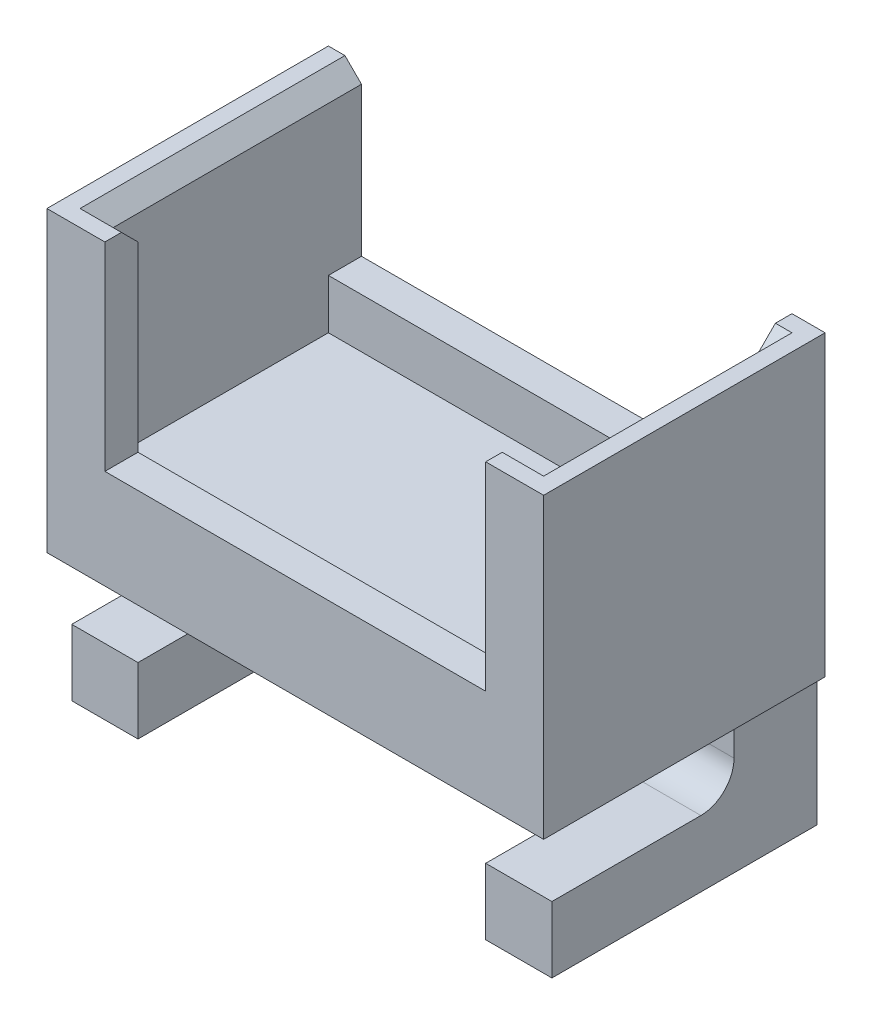
ISO-10303-21;
HEADER;
FILE_DESCRIPTION(('STEP AP214'),'2;1');
FILE_NAME('part.step','',(''),(''),'','','');
FILE_SCHEMA(('AUTOMOTIVE_DESIGN { 1 0 10303 214 1 1 1 1 }'));
ENDSEC;
DATA;
#1=APPLICATION_CONTEXT('core data for automotive mechanical design processes');
#2=APPLICATION_PROTOCOL_DEFINITION('international standard','automotive_design',2000,#1);
#3=PRODUCT_CONTEXT('',#1,'mechanical');
#4=PRODUCT('Part','Part','',(#3));
#5=PRODUCT_RELATED_PRODUCT_CATEGORY('part','',(#4));
#6=PRODUCT_DEFINITION_FORMATION('','',#4);
#7=PRODUCT_DEFINITION_CONTEXT('part definition',#1,'design');
#8=PRODUCT_DEFINITION('design','',#6,#7);
#9=PRODUCT_DEFINITION_SHAPE('','',#8);
#10=(LENGTH_UNIT() NAMED_UNIT(*) SI_UNIT(.MILLI.,.METRE.));
#11=(NAMED_UNIT(*) PLANE_ANGLE_UNIT() SI_UNIT($,.RADIAN.));
#12=(NAMED_UNIT(*) SI_UNIT($,.STERADIAN.) SOLID_ANGLE_UNIT());
#13=UNCERTAINTY_MEASURE_WITH_UNIT(LENGTH_MEASURE(1.E-05),#10,'distance_accuracy_value','');
#14=(GEOMETRIC_REPRESENTATION_CONTEXT(3) GLOBAL_UNCERTAINTY_ASSIGNED_CONTEXT((#13)) GLOBAL_UNIT_ASSIGNED_CONTEXT((#10,
#11,#12)) REPRESENTATION_CONTEXT('',''));
#15=CARTESIAN_POINT('',(0.,0.,0.));
#16=DIRECTION('',(0.,0.,1.));
#17=DIRECTION('',(1.,0.,0.));
#18=AXIS2_PLACEMENT_3D('',#15,#16,#17);
#19=CARTESIAN_POINT('',(-13.,15.,-6.5));
#20=DIRECTION('',(0.,0.,1.));
#21=DIRECTION('',(1.,0.,0.));
#22=AXIS2_PLACEMENT_3D('',#19,#20,#21);
#23=PLANE('',#22);
#24=DIRECTION('',(0.,-1.,0.));
#25=VECTOR('',#24,1.);
#26=CARTESIAN_POINT('',(13.,15.,-6.5));
#27=LINE('',#26,#25);
#28=CARTESIAN_POINT('',(13.,5.,-6.5));
#29=VERTEX_POINT('',#28);
#30=CARTESIAN_POINT('',(13.,2.,-6.5));
#31=VERTEX_POINT('',#30);
#32=EDGE_CURVE('E275',#29,#31,#27,.T.);
#33=ORIENTED_EDGE('',*,*,#32,.F.);
#34=DIRECTION('',(-1.,0.,0.));
#35=VECTOR('',#34,1.);
#36=CARTESIAN_POINT('',(-13.,5.,-6.5));
#37=LINE('',#36,#35);
#38=CARTESIAN_POINT('',(-13.,5.,-6.5));
#39=VERTEX_POINT('',#38);
#40=EDGE_CURVE('E256',#29,#39,#37,.T.);
#41=ORIENTED_EDGE('',*,*,#40,.T.);
#42=DIRECTION('',(0.,-1.,0.));
#43=VECTOR('',#42,1.);
#44=CARTESIAN_POINT('',(-13.,15.,-6.5));
#45=LINE('',#44,#43);
#46=CARTESIAN_POINT('',(-13.,2.,-6.5));
#47=VERTEX_POINT('',#46);
#48=EDGE_CURVE('E286',#39,#47,#45,.T.);
#49=ORIENTED_EDGE('',*,*,#48,.T.);
#50=DIRECTION('',(1.,0.,0.));
#51=VECTOR('',#50,1.);
#52=CARTESIAN_POINT('',(0.,2.,-6.5));
#53=LINE('',#52,#51);
#54=EDGE_CURVE('E283',#47,#31,#53,.T.);
#55=ORIENTED_EDGE('',*,*,#54,.T.);
#56=EDGE_LOOP('',(#33,#41,#49,#55));
#57=FACE_BOUND('',#56,.T.);
#58=ADVANCED_FACE('F48',(#57),#23,.T.);
#59=CARTESIAN_POINT('',(0.,15.,0.));
#60=DIRECTION('',(0.,-1.,0.));
#61=DIRECTION('',(0.,0.,-1.));
#62=AXIS2_PLACEMENT_3D('',#59,#60,#61);
#63=PLANE('',#62);
#64=DIRECTION('',(-1.,0.,0.));
#65=VECTOR('',#64,1.);
#66=CARTESIAN_POINT('',(-13.,15.,7.5));
#67=LINE('',#66,#65);
#68=CARTESIAN_POINT('',(-11.5,15.,7.5));
#69=VERTEX_POINT('',#68);
#70=CARTESIAN_POINT('',(-14.,15.,7.5));
#71=VERTEX_POINT('',#70);
#72=EDGE_CURVE('E339',#69,#71,#67,.T.);
#73=ORIENTED_EDGE('',*,*,#72,.T.);
#74=DIRECTION('',(0.,0.,-1.));
#75=VECTOR('',#74,1.);
#76=CARTESIAN_POINT('',(-14.,15.,-8.5));
#77=LINE('',#76,#75);
#78=CARTESIAN_POINT('',(-14.,15.,-8.5));
#79=VERTEX_POINT('',#78);
#80=EDGE_CURVE('E342',#71,#79,#77,.T.);
#81=ORIENTED_EDGE('',*,*,#80,.T.);
#82=DIRECTION('',(-1.,0.,0.));
#83=VECTOR('',#82,1.);
#84=CARTESIAN_POINT('',(15.,15.,-8.5));
#85=LINE('',#84,#83);
#86=CARTESIAN_POINT('',(-15.,15.,-8.5));
#87=VERTEX_POINT('',#86);
#88=EDGE_CURVE('E305',#79,#87,#85,.T.);
#89=ORIENTED_EDGE('',*,*,#88,.T.);
#90=DIRECTION('',(0.,0.,1.));
#91=VECTOR('',#90,1.);
#92=CARTESIAN_POINT('',(-15.,15.,-8.5));
#93=LINE('',#92,#91);
#94=CARTESIAN_POINT('',(-15.,15.,8.5));
#95=VERTEX_POINT('',#94);
#96=EDGE_CURVE('E285',#87,#95,#93,.T.);
#97=ORIENTED_EDGE('',*,*,#96,.T.);
#98=DIRECTION('',(1.,0.,0.));
#99=VECTOR('',#98,1.);
#100=CARTESIAN_POINT('',(15.,15.,8.5));
#101=LINE('',#100,#99);
#102=CARTESIAN_POINT('',(-11.5,15.,8.5));
#103=VERTEX_POINT('',#102);
#104=EDGE_CURVE('E297',#95,#103,#101,.T.);
#105=ORIENTED_EDGE('',*,*,#104,.T.);
#106=DIRECTION('',(0.,0.,1.));
#107=VECTOR('',#106,1.);
#108=CARTESIAN_POINT('',(-11.5,15.,-8.501));
#109=LINE('',#108,#107);
#110=EDGE_CURVE('E483',#69,#103,#109,.T.);
#111=ORIENTED_EDGE('',*,*,#110,.F.);
#112=EDGE_LOOP('',(#73,#81,#89,#97,#105,#111));
#113=FACE_BOUND('',#112,.T.);
#114=ADVANCED_FACE('F714',(#113),#63,.F.);
#115=CARTESIAN_POINT('',(15.,2.,-8.5));
#116=DIRECTION('',(0.,0.,1.));
#117=DIRECTION('',(1.,0.,0.));
#118=AXIS2_PLACEMENT_3D('',#115,#116,#117);
#119=PLANE('',#118);
#120=DIRECTION('',(0.,1.,0.));
#121=VECTOR('',#120,1.);
#122=CARTESIAN_POINT('',(-13.,15.,-8.5));
#123=LINE('',#122,#121);
#124=CARTESIAN_POINT('',(-13.,5.,-8.5));
#125=VERTEX_POINT('',#124);
#126=CARTESIAN_POINT('',(-13.,14.,-8.5));
#127=VERTEX_POINT('',#126);
#128=EDGE_CURVE('E379',#125,#127,#123,.T.);
#129=ORIENTED_EDGE('',*,*,#128,.F.);
#130=DIRECTION('',(-1.,0.,0.));
#131=VECTOR('',#130,1.);
#132=CARTESIAN_POINT('',(15.,5.,-8.5));
#133=LINE('',#132,#131);
#134=CARTESIAN_POINT('',(13.,5.,-8.5));
#135=VERTEX_POINT('',#134);
#136=EDGE_CURVE('E268',#135,#125,#133,.T.);
#137=ORIENTED_EDGE('',*,*,#136,.F.);
#138=DIRECTION('',(0.,1.,0.));
#139=VECTOR('',#138,1.);
#140=CARTESIAN_POINT('',(13.,2.,-8.5));
#141=LINE('',#140,#139);
#142=CARTESIAN_POINT('',(13.,15.,-8.5));
#143=VERTEX_POINT('',#142);
#144=EDGE_CURVE('E269',#135,#143,#141,.T.);
#145=ORIENTED_EDGE('',*,*,#144,.T.);
#146=CARTESIAN_POINT('',(15.,15.,-8.5));
#147=VERTEX_POINT('',#146);
#148=EDGE_CURVE('E306',#147,#143,#85,.T.);
#149=ORIENTED_EDGE('',*,*,#148,.F.);
#150=DIRECTION('',(0.,-1.,0.));
#151=VECTOR('',#150,1.);
#152=CARTESIAN_POINT('',(15.,2.,-8.5));
#153=LINE('',#152,#151);
#154=CARTESIAN_POINT('',(15.,-3.,-8.5));
#155=VERTEX_POINT('',#154);
#156=EDGE_CURVE('E323',#147,#155,#153,.T.);
#157=ORIENTED_EDGE('',*,*,#156,.T.);
#158=DIRECTION('',(1.,0.,0.));
#159=VECTOR('',#158,1.);
#160=CARTESIAN_POINT('',(-15.,-3.,-8.5));
#161=LINE('',#160,#159);
#162=CARTESIAN_POINT('',(14.5,-3.,-8.5));
#163=VERTEX_POINT('',#162);
#164=EDGE_CURVE('E430',#163,#155,#161,.T.);
#165=ORIENTED_EDGE('',*,*,#164,.F.);
#166=DIRECTION('',(0.,1.,0.));
#167=VECTOR('',#166,1.);
#168=CARTESIAN_POINT('',(14.5,-7.,-8.5));
#169=LINE('',#168,#167);
#170=CARTESIAN_POINT('',(14.5,-11.,-8.5));
#171=VERTEX_POINT('',#170);
#172=EDGE_CURVE('E564',#171,#163,#169,.T.);
#173=ORIENTED_EDGE('',*,*,#172,.F.);
#174=DIRECTION('',(1.,0.,0.));
#175=VECTOR('',#174,1.);
#176=CARTESIAN_POINT('',(14.5,-11.,-8.5));
#177=LINE('',#176,#175);
#178=CARTESIAN_POINT('',(10.5,-11.,-8.5));
#179=VERTEX_POINT('',#178);
#180=EDGE_CURVE('E514',#179,#171,#177,.T.);
#181=ORIENTED_EDGE('',*,*,#180,.F.);
#182=DIRECTION('',(0.,1.,0.));
#183=VECTOR('',#182,1.);
#184=CARTESIAN_POINT('',(10.5,-7.,-8.5));
#185=LINE('',#184,#183);
#186=CARTESIAN_POINT('',(10.5,-3.,-8.5));
#187=VERTEX_POINT('',#186);
#188=EDGE_CURVE('E567',#179,#187,#185,.T.);
#189=ORIENTED_EDGE('',*,*,#188,.T.);
#190=CARTESIAN_POINT('',(-10.5,-3.,-8.5));
#191=VERTEX_POINT('',#190);
#192=EDGE_CURVE('E639',#191,#187,#161,.T.);
#193=ORIENTED_EDGE('',*,*,#192,.F.);
#194=DIRECTION('',(0.,1.,0.));
#195=VECTOR('',#194,1.);
#196=CARTESIAN_POINT('',(-10.5,-7.,-8.5));
#197=LINE('',#196,#195);
#198=CARTESIAN_POINT('',(-10.5,-11.,-8.5));
#199=VERTEX_POINT('',#198);
#200=EDGE_CURVE('E618',#199,#191,#197,.T.);
#201=ORIENTED_EDGE('',*,*,#200,.F.);
#202=DIRECTION('',(-1.,0.,0.));
#203=VECTOR('',#202,1.);
#204=CARTESIAN_POINT('',(-14.5,-11.,-8.5));
#205=LINE('',#204,#203);
#206=CARTESIAN_POINT('',(-14.5,-11.,-8.5));
#207=VERTEX_POINT('',#206);
#208=EDGE_CURVE('E571',#199,#207,#205,.T.);
#209=ORIENTED_EDGE('',*,*,#208,.T.);
#210=DIRECTION('',(0.,1.,0.));
#211=VECTOR('',#210,1.);
#212=CARTESIAN_POINT('',(-14.5,-7.,-8.5));
#213=LINE('',#212,#211);
#214=CARTESIAN_POINT('',(-14.5,-3.,-8.5));
#215=VERTEX_POINT('',#214);
#216=EDGE_CURVE('E622',#207,#215,#213,.T.);
#217=ORIENTED_EDGE('',*,*,#216,.T.);
#218=CARTESIAN_POINT('',(-15.,-3.,-8.5));
#219=VERTEX_POINT('',#218);
#220=EDGE_CURVE('E636',#219,#215,#161,.T.);
#221=ORIENTED_EDGE('',*,*,#220,.F.);
#222=DIRECTION('',(0.,-1.,0.));
#223=VECTOR('',#222,1.);
#224=CARTESIAN_POINT('',(-15.,2.,-8.5));
#225=LINE('',#224,#223);
#226=EDGE_CURVE('E333',#87,#219,#225,.T.);
#227=ORIENTED_EDGE('',*,*,#226,.F.);
#228=ORIENTED_EDGE('',*,*,#88,.F.);
#229=DIRECTION('',(0.70710678118655,-0.707106781186545,0.));
#230=VECTOR('',#229,1.);
#231=CARTESIAN_POINT('',(-13.,14.,-8.5));
#232=LINE('',#231,#230);
#233=EDGE_CURVE('E345',#79,#127,#232,.T.);
#234=ORIENTED_EDGE('',*,*,#233,.T.);
#235=EDGE_LOOP('',(#129,#137,#145,#149,#157,#165,#173,#181,#189,#193,#201,#209,#217,#221,#227,
#228,#234));
#236=FACE_BOUND('',#235,.T.);
#237=ADVANCED_FACE('F429',(#236),#119,.F.);
#238=CARTESIAN_POINT('',(-15.,2.,-8.5));
#239=DIRECTION('',(1.,0.,0.));
#240=DIRECTION('',(0.,0.,-1.));
#241=AXIS2_PLACEMENT_3D('',#238,#239,#240);
#242=PLANE('',#241);
#243=ORIENTED_EDGE('',*,*,#226,.T.);
#244=DIRECTION('',(0.,0.,-1.));
#245=VECTOR('',#244,1.);
#246=CARTESIAN_POINT('',(-15.,-3.,8.5));
#247=LINE('',#246,#245);
#248=CARTESIAN_POINT('',(-15.,-3.,8.5));
#249=VERTEX_POINT('',#248);
#250=EDGE_CURVE('E632',#249,#219,#247,.T.);
#251=ORIENTED_EDGE('',*,*,#250,.F.);
#252=DIRECTION('',(0.,-1.,0.));
#253=VECTOR('',#252,1.);
#254=CARTESIAN_POINT('',(-15.,2.,8.5));
#255=LINE('',#254,#253);
#256=EDGE_CURVE('E330',#95,#249,#255,.T.);
#257=ORIENTED_EDGE('',*,*,#256,.F.);
#258=ORIENTED_EDGE('',*,*,#96,.F.);
#259=EDGE_LOOP('',(#243,#251,#257,#258));
#260=FACE_BOUND('',#259,.T.);
#261=ADVANCED_FACE('F646',(#260),#242,.F.);
#262=CARTESIAN_POINT('',(15.,2.,8.5));
#263=DIRECTION('',(0.,0.,1.));
#264=DIRECTION('',(1.,0.,0.));
#265=AXIS2_PLACEMENT_3D('',#262,#263,#264);
#266=PLANE('',#265);
#267=DIRECTION('',(0.,1.,0.));
#268=VECTOR('',#267,1.);
#269=CARTESIAN_POINT('',(11.5,15.,8.5));
#270=LINE('',#269,#268);
#271=CARTESIAN_POINT('',(11.5,3.,8.5));
#272=VERTEX_POINT('',#271);
#273=CARTESIAN_POINT('',(11.5,15.,8.5));
#274=VERTEX_POINT('',#273);
#275=EDGE_CURVE('E479',#272,#274,#270,.T.);
#276=ORIENTED_EDGE('',*,*,#275,.F.);
#277=DIRECTION('',(1.,0.,0.));
#278=VECTOR('',#277,1.);
#279=CARTESIAN_POINT('',(-11.5,3.,8.5));
#280=LINE('',#279,#278);
#281=CARTESIAN_POINT('',(-11.5,3.,8.5));
#282=VERTEX_POINT('',#281);
#283=EDGE_CURVE('E475',#282,#272,#280,.T.);
#284=ORIENTED_EDGE('',*,*,#283,.F.);
#285=DIRECTION('',(0.,-1.,0.));
#286=VECTOR('',#285,1.);
#287=CARTESIAN_POINT('',(-11.5,15.,8.5));
#288=LINE('',#287,#286);
#289=EDGE_CURVE('E466',#103,#282,#288,.T.);
#290=ORIENTED_EDGE('',*,*,#289,.F.);
#291=ORIENTED_EDGE('',*,*,#104,.F.);
#292=ORIENTED_EDGE('',*,*,#256,.T.);
#293=DIRECTION('',(-1.,0.,0.));
#294=VECTOR('',#293,1.);
#295=CARTESIAN_POINT('',(15.,-3.,8.5));
#296=LINE('',#295,#294);
#297=CARTESIAN_POINT('',(15.,-3.,8.5));
#298=VERTEX_POINT('',#297);
#299=EDGE_CURVE('E384',#298,#249,#296,.T.);
#300=ORIENTED_EDGE('',*,*,#299,.F.);
#301=DIRECTION('',(0.,-1.,0.));
#302=VECTOR('',#301,1.);
#303=CARTESIAN_POINT('',(15.,2.,8.5));
#304=LINE('',#303,#302);
#305=CARTESIAN_POINT('',(15.,15.,8.5));
#306=VERTEX_POINT('',#305);
#307=EDGE_CURVE('E327',#306,#298,#304,.T.);
#308=ORIENTED_EDGE('',*,*,#307,.F.);
#309=EDGE_CURVE('E291',#274,#306,#101,.T.);
#310=ORIENTED_EDGE('',*,*,#309,.F.);
#311=EDGE_LOOP('',(#276,#284,#290,#291,#292,#300,#308,#310));
#312=FACE_BOUND('',#311,.T.);
#313=ADVANCED_FACE('F420',(#312),#266,.T.);
#314=CARTESIAN_POINT('',(15.,2.,-8.5));
#315=DIRECTION('',(1.,0.,0.));
#316=DIRECTION('',(0.,0.,-1.));
#317=AXIS2_PLACEMENT_3D('',#314,#315,#316);
#318=PLANE('',#317);
#319=ORIENTED_EDGE('',*,*,#307,.T.);
#320=DIRECTION('',(0.,0.,1.));
#321=VECTOR('',#320,1.);
#322=CARTESIAN_POINT('',(15.,-3.,-8.5));
#323=LINE('',#322,#321);
#324=EDGE_CURVE('E426',#155,#298,#323,.T.);
#325=ORIENTED_EDGE('',*,*,#324,.F.);
#326=ORIENTED_EDGE('',*,*,#156,.F.);
#327=DIRECTION('',(0.,0.,-1.));
#328=VECTOR('',#327,1.);
#329=CARTESIAN_POINT('',(15.,15.,-8.5));
#330=LINE('',#329,#328);
#331=EDGE_CURVE('E301',#306,#147,#330,.T.);
#332=ORIENTED_EDGE('',*,*,#331,.F.);
#333=EDGE_LOOP('',(#319,#325,#326,#332));
#334=FACE_BOUND('',#333,.T.);
#335=ADVANCED_FACE('F425',(#334),#318,.T.);
#336=ORIENTED_EDGE('',*,*,#148,.T.);
#337=DIRECTION('',(0.,0.,-1.));
#338=VECTOR('',#337,1.);
#339=CARTESIAN_POINT('',(13.,15.,-6.5));
#340=LINE('',#339,#338);
#341=CARTESIAN_POINT('',(13.,15.,-7.5));
#342=VERTEX_POINT('',#341);
#343=EDGE_CURVE('E279',#342,#143,#340,.T.);
#344=ORIENTED_EDGE('',*,*,#343,.F.);
#345=DIRECTION('',(1.,0.,0.));
#346=VECTOR('',#345,1.);
#347=CARTESIAN_POINT('',(13.,15.,-7.5));
#348=LINE('',#347,#346);
#349=CARTESIAN_POINT('',(14.,15.,-7.5));
#350=VERTEX_POINT('',#349);
#351=EDGE_CURVE('E361',#342,#350,#348,.T.);
#352=ORIENTED_EDGE('',*,*,#351,.T.);
#353=DIRECTION('',(0.,0.,1.));
#354=VECTOR('',#353,1.);
#355=CARTESIAN_POINT('',(14.,15.,6.5));
#356=LINE('',#355,#354);
#357=CARTESIAN_POINT('',(14.,15.,7.5));
#358=VERTEX_POINT('',#357);
#359=EDGE_CURVE('E358',#350,#358,#356,.T.);
#360=ORIENTED_EDGE('',*,*,#359,.T.);
#361=DIRECTION('',(-1.,0.,0.));
#362=VECTOR('',#361,1.);
#363=CARTESIAN_POINT('',(11.5,15.,7.5));
#364=LINE('',#363,#362);
#365=CARTESIAN_POINT('',(11.5,15.,7.5));
#366=VERTEX_POINT('',#365);
#367=EDGE_CURVE('E364',#358,#366,#364,.T.);
#368=ORIENTED_EDGE('',*,*,#367,.T.);
#369=DIRECTION('',(0.,0.,1.));
#370=VECTOR('',#369,1.);
#371=CARTESIAN_POINT('',(11.5,15.,-8.501));
#372=LINE('',#371,#370);
#373=EDGE_CURVE('E415',#366,#274,#372,.T.);
#374=ORIENTED_EDGE('',*,*,#373,.T.);
#375=ORIENTED_EDGE('',*,*,#309,.T.);
#376=ORIENTED_EDGE('',*,*,#331,.T.);
#377=EDGE_LOOP('',(#336,#344,#352,#360,#368,#374,#375,#376));
#378=FACE_BOUND('',#377,.T.);
#379=ADVANCED_FACE('F411',(#378),#63,.F.);
#380=CARTESIAN_POINT('',(13.,15.,-6.5));
#381=DIRECTION('',(-1.,0.,0.));
#382=DIRECTION('',(0.,0.,1.));
#383=AXIS2_PLACEMENT_3D('',#380,#381,#382);
#384=PLANE('',#383);
#385=DIRECTION('',(0.,-1.,0.));
#386=VECTOR('',#385,1.);
#387=CARTESIAN_POINT('',(13.,15.,6.5));
#388=LINE('',#387,#386);
#389=CARTESIAN_POINT('',(13.,14.,6.5));
#390=VERTEX_POINT('',#389);
#391=CARTESIAN_POINT('',(13.,2.,6.5));
#392=VERTEX_POINT('',#391);
#393=EDGE_CURVE('E495',#390,#392,#388,.T.);
#394=ORIENTED_EDGE('',*,*,#393,.F.);
#395=DIRECTION('',(0.,0.,-1.));
#396=VECTOR('',#395,1.);
#397=CARTESIAN_POINT('',(13.,14.,-6.5));
#398=LINE('',#397,#396);
#399=CARTESIAN_POINT('',(13.,14.,-6.5));
#400=VERTEX_POINT('',#399);
#401=EDGE_CURVE('E370',#390,#400,#398,.T.);
#402=ORIENTED_EDGE('',*,*,#401,.T.);
#403=DIRECTION('',(0.,0.707106781186545,-0.70710678118655));
#404=VECTOR('',#403,1.);
#405=CARTESIAN_POINT('',(13.,14.,-6.5));
#406=LINE('',#405,#404);
#407=EDGE_CURVE('E439',#400,#342,#406,.T.);
#408=ORIENTED_EDGE('',*,*,#407,.T.);
#409=ORIENTED_EDGE('',*,*,#343,.T.);
#410=ORIENTED_EDGE('',*,*,#144,.F.);
#411=DIRECTION('',(0.,0.,-1.));
#412=VECTOR('',#411,1.);
#413=CARTESIAN_POINT('',(13.,5.,-6.5));
#414=LINE('',#413,#412);
#415=EDGE_CURVE('E260',#29,#135,#414,.T.);
#416=ORIENTED_EDGE('',*,*,#415,.F.);
#417=ORIENTED_EDGE('',*,*,#32,.T.);
#418=DIRECTION('',(0.,0.,1.));
#419=VECTOR('',#418,1.);
#420=CARTESIAN_POINT('',(13.,2.,0.));
#421=LINE('',#420,#419);
#422=EDGE_CURVE('E320',#31,#392,#421,.T.);
#423=ORIENTED_EDGE('',*,*,#422,.T.);
#424=EDGE_LOOP('',(#394,#402,#408,#409,#410,#416,#417,#423));
#425=FACE_BOUND('',#424,.T.);
#426=ADVANCED_FACE('F273',(#425),#384,.T.);
#427=CARTESIAN_POINT('',(-13.,15.,-6.5));
#428=DIRECTION('',(1.,0.,0.));
#429=DIRECTION('',(0.,0.,-1.));
#430=AXIS2_PLACEMENT_3D('',#427,#428,#429);
#431=PLANE('',#430);
#432=ORIENTED_EDGE('',*,*,#48,.F.);
#433=DIRECTION('',(0.,0.,1.));
#434=VECTOR('',#433,1.);
#435=CARTESIAN_POINT('',(-13.,5.,-9.51749325564199));
#436=LINE('',#435,#434);
#437=EDGE_CURVE('E263',#125,#39,#436,.T.);
#438=ORIENTED_EDGE('',*,*,#437,.F.);
#439=ORIENTED_EDGE('',*,*,#128,.T.);
#440=DIRECTION('',(0.,0.,1.));
#441=VECTOR('',#440,1.);
#442=CARTESIAN_POINT('',(-13.,14.,6.5));
#443=LINE('',#442,#441);
#444=CARTESIAN_POINT('',(-13.,14.,6.5));
#445=VERTEX_POINT('',#444);
#446=EDGE_CURVE('E336',#127,#445,#443,.T.);
#447=ORIENTED_EDGE('',*,*,#446,.T.);
#448=DIRECTION('',(0.,-1.,0.));
#449=VECTOR('',#448,1.);
#450=CARTESIAN_POINT('',(-13.,15.,6.5));
#451=LINE('',#450,#449);
#452=CARTESIAN_POINT('',(-13.,2.,6.5));
#453=VERTEX_POINT('',#452);
#454=EDGE_CURVE('E293',#445,#453,#451,.T.);
#455=ORIENTED_EDGE('',*,*,#454,.T.);
#456=DIRECTION('',(0.,0.,-1.));
#457=VECTOR('',#456,1.);
#458=CARTESIAN_POINT('',(-13.,2.,0.));
#459=LINE('',#458,#457);
#460=EDGE_CURVE('E314',#453,#47,#459,.T.);
#461=ORIENTED_EDGE('',*,*,#460,.T.);
#462=EDGE_LOOP('',(#432,#438,#439,#447,#455,#461));
#463=FACE_BOUND('',#462,.T.);
#464=ADVANCED_FACE('F500',(#463),#431,.T.);
#465=CARTESIAN_POINT('',(-13.,15.,6.5));
#466=DIRECTION('',(0.,0.,-1.));
#467=DIRECTION('',(-1.,0.,0.));
#468=AXIS2_PLACEMENT_3D('',#465,#466,#467);
#469=PLANE('',#468);
#470=ORIENTED_EDGE('',*,*,#454,.F.);
#471=DIRECTION('',(1.,0.,0.));
#472=VECTOR('',#471,1.);
#473=CARTESIAN_POINT('',(-11.5,14.,6.5));
#474=LINE('',#473,#472);
#475=CARTESIAN_POINT('',(-11.5,14.,6.5));
#476=VERTEX_POINT('',#475);
#477=EDGE_CURVE('E352',#445,#476,#474,.T.);
#478=ORIENTED_EDGE('',*,*,#477,.T.);
#479=DIRECTION('',(0.,-1.,0.));
#480=VECTOR('',#479,1.);
#481=CARTESIAN_POINT('',(-11.5,15.,6.5));
#482=LINE('',#481,#480);
#483=CARTESIAN_POINT('',(-11.5,3.,6.5));
#484=VERTEX_POINT('',#483);
#485=EDGE_CURVE('E462',#476,#484,#482,.T.);
#486=ORIENTED_EDGE('',*,*,#485,.T.);
#487=DIRECTION('',(1.,0.,0.));
#488=VECTOR('',#487,1.);
#489=CARTESIAN_POINT('',(-11.5,3.,6.5));
#490=LINE('',#489,#488);
#491=CARTESIAN_POINT('',(11.5,3.,6.5));
#492=VERTEX_POINT('',#491);
#493=EDGE_CURVE('E460',#484,#492,#490,.T.);
#494=ORIENTED_EDGE('',*,*,#493,.T.);
#495=DIRECTION('',(0.,1.,0.));
#496=VECTOR('',#495,1.);
#497=CARTESIAN_POINT('',(11.5,15.,6.5));
#498=LINE('',#497,#496);
#499=CARTESIAN_POINT('',(11.5,14.,6.5));
#500=VERTEX_POINT('',#499);
#501=EDGE_CURVE('E453',#492,#500,#498,.T.);
#502=ORIENTED_EDGE('',*,*,#501,.T.);
#503=DIRECTION('',(1.,0.,0.));
#504=VECTOR('',#503,1.);
#505=CARTESIAN_POINT('',(13.,14.,6.5));
#506=LINE('',#505,#504);
#507=EDGE_CURVE('E348',#500,#390,#506,.T.);
#508=ORIENTED_EDGE('',*,*,#507,.T.);
#509=ORIENTED_EDGE('',*,*,#393,.T.);
#510=DIRECTION('',(-1.,0.,0.));
#511=VECTOR('',#510,1.);
#512=CARTESIAN_POINT('',(0.,2.,6.5));
#513=LINE('',#512,#511);
#514=EDGE_CURVE('E310',#392,#453,#513,.T.);
#515=ORIENTED_EDGE('',*,*,#514,.T.);
#516=EDGE_LOOP('',(#470,#478,#486,#494,#502,#508,#509,#515));
#517=FACE_BOUND('',#516,.T.);
#518=ADVANCED_FACE('F458',(#517),#469,.T.);
#519=CARTESIAN_POINT('',(0.,2.,0.));
#520=DIRECTION('',(0.,1.,0.));
#521=DIRECTION('',(0.,0.,1.));
#522=AXIS2_PLACEMENT_3D('',#519,#520,#521);
#523=PLANE('',#522);
#524=ORIENTED_EDGE('',*,*,#422,.F.);
#525=ORIENTED_EDGE('',*,*,#54,.F.);
#526=ORIENTED_EDGE('',*,*,#460,.F.);
#527=ORIENTED_EDGE('',*,*,#514,.F.);
#528=EDGE_LOOP('',(#524,#525,#526,#527));
#529=FACE_BOUND('',#528,.T.);
#530=ADVANCED_FACE('F504',(#529),#523,.T.);
#531=CARTESIAN_POINT('',(-11.5,3.,-8.501));
#532=DIRECTION('',(0.,-1.,0.));
#533=DIRECTION('',(0.,0.,-1.));
#534=AXIS2_PLACEMENT_3D('',#531,#532,#533);
#535=PLANE('',#534);
#536=DIRECTION('',(0.,0.,1.));
#537=VECTOR('',#536,1.);
#538=CARTESIAN_POINT('',(-11.5,3.,-8.501));
#539=LINE('',#538,#537);
#540=EDGE_CURVE('E482',#484,#282,#539,.T.);
#541=ORIENTED_EDGE('',*,*,#540,.T.);
#542=ORIENTED_EDGE('',*,*,#283,.T.);
#543=DIRECTION('',(0.,0.,1.));
#544=VECTOR('',#543,1.);
#545=CARTESIAN_POINT('',(11.5,3.,-8.501));
#546=LINE('',#545,#544);
#547=EDGE_CURVE('E488',#492,#272,#546,.T.);
#548=ORIENTED_EDGE('',*,*,#547,.F.);
#549=ORIENTED_EDGE('',*,*,#493,.F.);
#550=EDGE_LOOP('',(#541,#542,#548,#549));
#551=FACE_BOUND('',#550,.T.);
#552=ADVANCED_FACE('F731',(#551),#535,.F.);
#553=CARTESIAN_POINT('',(11.5,15.,-8.501));
#554=DIRECTION('',(1.,0.,0.));
#555=DIRECTION('',(0.,1.,0.));
#556=AXIS2_PLACEMENT_3D('',#553,#554,#555);
#557=PLANE('',#556);
#558=ORIENTED_EDGE('',*,*,#373,.F.);
#559=DIRECTION('',(0.,-0.707106781186545,-0.70710678118655));
#560=VECTOR('',#559,1.);
#561=CARTESIAN_POINT('',(11.5,14.,6.5));
#562=LINE('',#561,#560);
#563=EDGE_CURVE('E367',#366,#500,#562,.T.);
#564=ORIENTED_EDGE('',*,*,#563,.T.);
#565=ORIENTED_EDGE('',*,*,#501,.F.);
#566=ORIENTED_EDGE('',*,*,#547,.T.);
#567=ORIENTED_EDGE('',*,*,#275,.T.);
#568=EDGE_LOOP('',(#558,#564,#565,#566,#567));
#569=FACE_BOUND('',#568,.T.);
#570=ADVANCED_FACE('F452',(#569),#557,.F.);
#571=CARTESIAN_POINT('',(-11.5,15.,-8.501));
#572=DIRECTION('',(-1.,0.,0.));
#573=DIRECTION('',(0.,-1.,0.));
#574=AXIS2_PLACEMENT_3D('',#571,#572,#573);
#575=PLANE('',#574);
#576=ORIENTED_EDGE('',*,*,#485,.F.);
#577=DIRECTION('',(0.,0.707106781186545,0.70710678118655));
#578=VECTOR('',#577,1.);
#579=CARTESIAN_POINT('',(-11.5,14.,6.5));
#580=LINE('',#579,#578);
#581=EDGE_CURVE('E355',#476,#69,#580,.T.);
#582=ORIENTED_EDGE('',*,*,#581,.T.);
#583=ORIENTED_EDGE('',*,*,#110,.T.);
#584=ORIENTED_EDGE('',*,*,#289,.T.);
#585=ORIENTED_EDGE('',*,*,#540,.F.);
#586=EDGE_LOOP('',(#576,#582,#583,#584,#585));
#587=FACE_BOUND('',#586,.T.);
#588=ADVANCED_FACE('F753',(#587),#575,.F.);
#589=CARTESIAN_POINT('',(-13.,14.,6.5));
#590=DIRECTION('',(0.,0.70710678118655,-0.707106781186545));
#591=DIRECTION('',(-1.,0.,0.));
#592=AXIS2_PLACEMENT_3D('',#589,#590,#591);
#593=PLANE('',#592);
#594=ORIENTED_EDGE('',*,*,#581,.F.);
#595=ORIENTED_EDGE('',*,*,#477,.F.);
#596=DIRECTION('',(-0.577350269189627,0.577350269189623,0.577350269189627));
#597=VECTOR('',#596,1.);
#598=CARTESIAN_POINT('',(-8.66666666666665,9.66666666666668,2.16666666666665));
#599=LINE('',#598,#597);
#600=EDGE_CURVE('E375',#71,#445,#599,.F.);
#601=ORIENTED_EDGE('',*,*,#600,.F.);
#602=ORIENTED_EDGE('',*,*,#72,.F.);
#603=EDGE_LOOP('',(#594,#595,#601,#602));
#604=FACE_BOUND('',#603,.T.);
#605=ADVANCED_FACE('F747',(#604),#593,.T.);
#606=CARTESIAN_POINT('',(-13.,14.,-6.5));
#607=DIRECTION('',(0.707106781186545,0.70710678118655,0.));
#608=DIRECTION('',(0.,0.,-1.));
#609=AXIS2_PLACEMENT_3D('',#606,#607,#608);
#610=PLANE('',#609);
#611=ORIENTED_EDGE('',*,*,#233,.F.);
#612=ORIENTED_EDGE('',*,*,#80,.F.);
#613=ORIENTED_EDGE('',*,*,#600,.T.);
#614=ORIENTED_EDGE('',*,*,#446,.F.);
#615=EDGE_LOOP('',(#611,#612,#613,#614));
#616=FACE_BOUND('',#615,.T.);
#617=ADVANCED_FACE('F740',(#616),#610,.T.);
#618=CARTESIAN_POINT('',(-13.,14.,-6.5));
#619=DIRECTION('',(0.,0.70710678118655,0.707106781186545));
#620=DIRECTION('',(1.,0.,0.));
#621=AXIS2_PLACEMENT_3D('',#618,#619,#620);
#622=PLANE('',#621);
#623=ORIENTED_EDGE('',*,*,#407,.F.);
#624=DIRECTION('',(-0.577350269189627,-0.577350269189623,0.577350269189627));
#625=VECTOR('',#624,1.);
#626=CARTESIAN_POINT('',(4.3333333333333,5.33333333333336,2.1666666666667));
#627=LINE('',#626,#625);
#628=EDGE_CURVE('E380',#350,#400,#627,.T.);
#629=ORIENTED_EDGE('',*,*,#628,.F.);
#630=ORIENTED_EDGE('',*,*,#351,.F.);
#631=EDGE_LOOP('',(#623,#629,#630));
#632=FACE_BOUND('',#631,.T.);
#633=ADVANCED_FACE('F438',(#632),#622,.T.);
#634=CARTESIAN_POINT('',(13.,14.,-6.5));
#635=DIRECTION('',(-0.707106781186545,0.70710678118655,0.));
#636=DIRECTION('',(0.,0.,1.));
#637=AXIS2_PLACEMENT_3D('',#634,#635,#636);
#638=PLANE('',#637);
#639=ORIENTED_EDGE('',*,*,#628,.T.);
#640=ORIENTED_EDGE('',*,*,#401,.F.);
#641=DIRECTION('',(0.577350269189627,0.577350269189623,0.577350269189627));
#642=VECTOR('',#641,1.);
#643=CARTESIAN_POINT('',(4.33333333333329,5.33333333333336,-2.1666666666667));
#644=LINE('',#643,#642);
#645=EDGE_CURVE('E381',#358,#390,#644,.F.);
#646=ORIENTED_EDGE('',*,*,#645,.F.);
#647=ORIENTED_EDGE('',*,*,#359,.F.);
#648=EDGE_LOOP('',(#639,#640,#646,#647));
#649=FACE_BOUND('',#648,.T.);
#650=ADVANCED_FACE('F444',(#649),#638,.T.);
#651=CARTESIAN_POINT('',(-13.,14.,6.5));
#652=DIRECTION('',(0.,0.70710678118655,-0.707106781186545));
#653=DIRECTION('',(-1.,0.,0.));
#654=AXIS2_PLACEMENT_3D('',#651,#652,#653);
#655=PLANE('',#654);
#656=ORIENTED_EDGE('',*,*,#563,.F.);
#657=ORIENTED_EDGE('',*,*,#367,.F.);
#658=ORIENTED_EDGE('',*,*,#645,.T.);
#659=ORIENTED_EDGE('',*,*,#507,.F.);
#660=EDGE_LOOP('',(#656,#657,#658,#659));
#661=FACE_BOUND('',#660,.T.);
#662=ADVANCED_FACE('F448',(#661),#655,.T.);
#663=CARTESIAN_POINT('',(0.,-3.,0.));
#664=DIRECTION('',(0.,-1.,0.));
#665=DIRECTION('',(0.,0.,-1.));
#666=AXIS2_PLACEMENT_3D('',#663,#664,#665);
#667=PLANE('',#666);
#668=DIRECTION('',(0.,0.,1.));
#669=VECTOR('',#668,1.);
#670=CARTESIAN_POINT('',(10.5,-3.,-8.5));
#671=LINE('',#670,#669);
#672=CARTESIAN_POINT('',(10.5,-3.,-3.5));
#673=VERTEX_POINT('',#672);
#674=EDGE_CURVE('E536',#187,#673,#671,.T.);
#675=ORIENTED_EDGE('',*,*,#674,.T.);
#676=DIRECTION('',(1.,0.,0.));
#677=VECTOR('',#676,1.);
#678=CARTESIAN_POINT('',(12.5,-3.,-3.5));
#679=LINE('',#678,#677);
#680=CARTESIAN_POINT('',(14.5,-3.,-3.5));
#681=VERTEX_POINT('',#680);
#682=EDGE_CURVE('E554',#673,#681,#679,.T.);
#683=ORIENTED_EDGE('',*,*,#682,.T.);
#684=DIRECTION('',(0.,0.,-1.));
#685=VECTOR('',#684,1.);
#686=CARTESIAN_POINT('',(14.5,-3.,-3.5));
#687=LINE('',#686,#685);
#688=EDGE_CURVE('E551',#681,#163,#687,.T.);
#689=ORIENTED_EDGE('',*,*,#688,.T.);
#690=ORIENTED_EDGE('',*,*,#164,.T.);
#691=ORIENTED_EDGE('',*,*,#324,.T.);
#692=ORIENTED_EDGE('',*,*,#299,.T.);
#693=ORIENTED_EDGE('',*,*,#250,.T.);
#694=ORIENTED_EDGE('',*,*,#220,.T.);
#695=DIRECTION('',(0.,0.,-1.));
#696=VECTOR('',#695,1.);
#697=CARTESIAN_POINT('',(-14.5,-3.,-3.5));
#698=LINE('',#697,#696);
#699=CARTESIAN_POINT('',(-14.5,-3.,-3.5));
#700=VERTEX_POINT('',#699);
#701=EDGE_CURVE('E614',#700,#215,#698,.T.);
#702=ORIENTED_EDGE('',*,*,#701,.F.);
#703=DIRECTION('',(-1.,0.,0.));
#704=VECTOR('',#703,1.);
#705=CARTESIAN_POINT('',(-12.5,-3.,-3.5));
#706=LINE('',#705,#704);
#707=CARTESIAN_POINT('',(-10.5,-3.,-3.5));
#708=VERTEX_POINT('',#707);
#709=EDGE_CURVE('E610',#708,#700,#706,.T.);
#710=ORIENTED_EDGE('',*,*,#709,.F.);
#711=DIRECTION('',(0.,0.,1.));
#712=VECTOR('',#711,1.);
#713=CARTESIAN_POINT('',(-10.5,-3.,-8.5));
#714=LINE('',#713,#712);
#715=EDGE_CURVE('E595',#191,#708,#714,.T.);
#716=ORIENTED_EDGE('',*,*,#715,.F.);
#717=ORIENTED_EDGE('',*,*,#192,.T.);
#718=EDGE_LOOP('',(#675,#683,#689,#690,#691,#692,#693,#694,#702,#710,#716,#717));
#719=FACE_BOUND('',#718,.T.);
#720=ADVANCED_FACE('F644',(#719),#667,.T.);
#721=CARTESIAN_POINT('',(-10.5,-7.,-8.5));
#722=DIRECTION('',(-1.,0.,0.));
#723=DIRECTION('',(0.,0.,1.));
#724=AXIS2_PLACEMENT_3D('',#721,#722,#723);
#725=PLANE('',#724);
#726=ORIENTED_EDGE('',*,*,#715,.T.);
#727=DIRECTION('',(0.,1.,0.));
#728=VECTOR('',#727,1.);
#729=CARTESIAN_POINT('',(-10.5,-7.,-3.5));
#730=LINE('',#729,#728);
#731=CARTESIAN_POINT('',(-10.5,-5.,-3.5));
#732=VERTEX_POINT('',#731);
#733=EDGE_CURVE('E629',#732,#708,#730,.T.);
#734=ORIENTED_EDGE('',*,*,#733,.F.);
#735=CARTESIAN_POINT('',(-10.5,-5.,-1.5));
#736=DIRECTION('',(-1.,0.,0.));
#737=DIRECTION('',(0.,0.,1.));
#738=AXIS2_PLACEMENT_3D('',#735,#736,#737);
#739=CIRCLE('',#738,2.);
#740=CARTESIAN_POINT('',(-10.5,-7.,-1.5));
#741=VERTEX_POINT('',#740);
#742=EDGE_CURVE('E11',#732,#741,#739,.T.);
#743=ORIENTED_EDGE('',*,*,#742,.T.);
#744=DIRECTION('',(0.,0.,-1.));
#745=VECTOR('',#744,1.);
#746=CARTESIAN_POINT('',(-10.5,-7.,7.5));
#747=LINE('',#746,#745);
#748=CARTESIAN_POINT('',(-10.5,-7.,7.5));
#749=VERTEX_POINT('',#748);
#750=EDGE_CURVE('E588',#749,#741,#747,.T.);
#751=ORIENTED_EDGE('',*,*,#750,.F.);
#752=DIRECTION('',(0.,-1.,0.));
#753=VECTOR('',#752,1.);
#754=CARTESIAN_POINT('',(-10.5,-11.,7.5));
#755=LINE('',#754,#753);
#756=CARTESIAN_POINT('',(-10.5,-11.,7.5));
#757=VERTEX_POINT('',#756);
#758=EDGE_CURVE('E576',#749,#757,#755,.T.);
#759=ORIENTED_EDGE('',*,*,#758,.T.);
#760=DIRECTION('',(0.,0.,-1.));
#761=VECTOR('',#760,1.);
#762=CARTESIAN_POINT('',(-10.5,-11.,7.5));
#763=LINE('',#762,#761);
#764=EDGE_CURVE('E600',#757,#199,#763,.T.);
#765=ORIENTED_EDGE('',*,*,#764,.T.);
#766=ORIENTED_EDGE('',*,*,#200,.T.);
#767=EDGE_LOOP('',(#726,#734,#743,#751,#759,#765,#766));
#768=FACE_BOUND('',#767,.T.);
#769=ADVANCED_FACE('F660',(#768),#725,.F.);
#770=CARTESIAN_POINT('',(-12.5,-7.,-3.5));
#771=DIRECTION('',(0.,0.,-1.));
#772=DIRECTION('',(-1.,0.,0.));
#773=AXIS2_PLACEMENT_3D('',#770,#771,#772);
#774=PLANE('',#773);
#775=DIRECTION('',(0.,1.,0.));
#776=VECTOR('',#775,1.);
#777=CARTESIAN_POINT('',(-14.5,-7.,-3.5));
#778=LINE('',#777,#776);
#779=CARTESIAN_POINT('',(-14.5,-5.,-3.5));
#780=VERTEX_POINT('',#779);
#781=EDGE_CURVE('E626',#780,#700,#778,.T.);
#782=ORIENTED_EDGE('',*,*,#781,.F.);
#783=DIRECTION('',(-1.,0.,0.));
#784=VECTOR('',#783,1.);
#785=CARTESIAN_POINT('',(-12.5,-5.,-3.5));
#786=LINE('',#785,#784);
#787=EDGE_CURVE('E64',#780,#732,#786,.F.);
#788=ORIENTED_EDGE('',*,*,#787,.T.);
#789=ORIENTED_EDGE('',*,*,#733,.T.);
#790=ORIENTED_EDGE('',*,*,#709,.T.);
#791=EDGE_LOOP('',(#782,#788,#789,#790));
#792=FACE_BOUND('',#791,.T.);
#793=ADVANCED_FACE('F655',(#792),#774,.F.);
#794=CARTESIAN_POINT('',(-14.5,-7.,-3.5));
#795=DIRECTION('',(1.,0.,0.));
#796=DIRECTION('',(0.,0.,-1.));
#797=AXIS2_PLACEMENT_3D('',#794,#795,#796);
#798=PLANE('',#797);
#799=ORIENTED_EDGE('',*,*,#701,.T.);
#800=ORIENTED_EDGE('',*,*,#216,.F.);
#801=DIRECTION('',(0.,0.,-1.));
#802=VECTOR('',#801,1.);
#803=CARTESIAN_POINT('',(-14.5,-11.,7.5));
#804=LINE('',#803,#802);
#805=CARTESIAN_POINT('',(-14.5,-11.,7.5));
#806=VERTEX_POINT('',#805);
#807=EDGE_CURVE('E596',#806,#207,#804,.T.);
#808=ORIENTED_EDGE('',*,*,#807,.F.);
#809=DIRECTION('',(0.,1.,0.));
#810=VECTOR('',#809,1.);
#811=CARTESIAN_POINT('',(-14.5,-7.,7.5));
#812=LINE('',#811,#810);
#813=CARTESIAN_POINT('',(-14.5,-7.,7.5));
#814=VERTEX_POINT('',#813);
#815=EDGE_CURVE('E584',#806,#814,#812,.T.);
#816=ORIENTED_EDGE('',*,*,#815,.T.);
#817=DIRECTION('',(0.,0.,-1.));
#818=VECTOR('',#817,1.);
#819=CARTESIAN_POINT('',(-14.5,-7.,7.5));
#820=LINE('',#819,#818);
#821=CARTESIAN_POINT('',(-14.5,-7.,-1.5));
#822=VERTEX_POINT('',#821);
#823=EDGE_CURVE('E592',#814,#822,#820,.T.);
#824=ORIENTED_EDGE('',*,*,#823,.T.);
#825=CARTESIAN_POINT('',(-14.5,-5.,-1.5));
#826=DIRECTION('',(1.,0.,0.));
#827=DIRECTION('',(0.,0.,-1.));
#828=AXIS2_PLACEMENT_3D('',#825,#826,#827);
#829=CIRCLE('',#828,2.);
#830=EDGE_CURVE('E57',#822,#780,#829,.T.);
#831=ORIENTED_EDGE('',*,*,#830,.T.);
#832=ORIENTED_EDGE('',*,*,#781,.T.);
#833=EDGE_LOOP('',(#799,#800,#808,#816,#824,#831,#832));
#834=FACE_BOUND('',#833,.T.);
#835=ADVANCED_FACE('F654',(#834),#798,.F.);
#836=CARTESIAN_POINT('',(-10.5,-7.,7.5));
#837=DIRECTION('',(0.,1.,0.));
#838=DIRECTION('',(0.,0.,1.));
#839=AXIS2_PLACEMENT_3D('',#836,#837,#838);
#840=PLANE('',#839);
#841=ORIENTED_EDGE('',*,*,#750,.T.);
#842=DIRECTION('',(-1.,0.,0.));
#843=VECTOR('',#842,1.);
#844=CARTESIAN_POINT('',(-10.5,-7.,-1.5));
#845=LINE('',#844,#843);
#846=EDGE_CURVE('E394',#741,#822,#845,.T.);
#847=ORIENTED_EDGE('',*,*,#846,.T.);
#848=ORIENTED_EDGE('',*,*,#823,.F.);
#849=DIRECTION('',(1.,0.,0.));
#850=VECTOR('',#849,1.);
#851=CARTESIAN_POINT('',(-10.5,-7.,7.5));
#852=LINE('',#851,#850);
#853=EDGE_CURVE('E572',#814,#749,#852,.T.);
#854=ORIENTED_EDGE('',*,*,#853,.T.);
#855=EDGE_LOOP('',(#841,#847,#848,#854));
#856=FACE_BOUND('',#855,.T.);
#857=ADVANCED_FACE('F663',(#856),#840,.T.);
#858=CARTESIAN_POINT('',(-14.5,-11.,7.5));
#859=DIRECTION('',(0.,-1.,0.));
#860=DIRECTION('',(0.,0.,-1.));
#861=AXIS2_PLACEMENT_3D('',#858,#859,#860);
#862=PLANE('',#861);
#863=ORIENTED_EDGE('',*,*,#208,.F.);
#864=ORIENTED_EDGE('',*,*,#764,.F.);
#865=DIRECTION('',(-1.,0.,0.));
#866=VECTOR('',#865,1.);
#867=CARTESIAN_POINT('',(-14.5,-11.,7.5));
#868=LINE('',#867,#866);
#869=EDGE_CURVE('E580',#757,#806,#868,.T.);
#870=ORIENTED_EDGE('',*,*,#869,.T.);
#871=ORIENTED_EDGE('',*,*,#807,.T.);
#872=EDGE_LOOP('',(#863,#864,#870,#871));
#873=FACE_BOUND('',#872,.T.);
#874=ADVANCED_FACE('F671',(#873),#862,.T.);
#875=CARTESIAN_POINT('',(0.,0.,7.5));
#876=DIRECTION('',(0.,0.,1.));
#877=DIRECTION('',(1.,0.,0.));
#878=AXIS2_PLACEMENT_3D('',#875,#876,#877);
#879=PLANE('',#878);
#880=ORIENTED_EDGE('',*,*,#853,.F.);
#881=ORIENTED_EDGE('',*,*,#815,.F.);
#882=ORIENTED_EDGE('',*,*,#869,.F.);
#883=ORIENTED_EDGE('',*,*,#758,.F.);
#884=EDGE_LOOP('',(#880,#881,#882,#883));
#885=FACE_BOUND('',#884,.T.);
#886=ADVANCED_FACE('F667',(#885),#879,.T.);
#887=CARTESIAN_POINT('',(10.5,-7.,-8.5));
#888=DIRECTION('',(-1.,0.,0.));
#889=DIRECTION('',(0.,0.,1.));
#890=AXIS2_PLACEMENT_3D('',#887,#888,#889);
#891=PLANE('',#890);
#892=ORIENTED_EDGE('',*,*,#674,.F.);
#893=ORIENTED_EDGE('',*,*,#188,.F.);
#894=DIRECTION('',(0.,0.,-1.));
#895=VECTOR('',#894,1.);
#896=CARTESIAN_POINT('',(10.5,-11.,7.5));
#897=LINE('',#896,#895);
#898=CARTESIAN_POINT('',(10.5,-11.,7.5));
#899=VERTEX_POINT('',#898);
#900=EDGE_CURVE('E537',#899,#179,#897,.T.);
#901=ORIENTED_EDGE('',*,*,#900,.F.);
#902=DIRECTION('',(0.,-1.,0.));
#903=VECTOR('',#902,1.);
#904=CARTESIAN_POINT('',(10.5,-11.,7.5));
#905=LINE('',#904,#903);
#906=CARTESIAN_POINT('',(10.5,-7.,7.5));
#907=VERTEX_POINT('',#906);
#908=EDGE_CURVE('E525',#907,#899,#905,.T.);
#909=ORIENTED_EDGE('',*,*,#908,.F.);
#910=DIRECTION('',(0.,0.,-1.));
#911=VECTOR('',#910,1.);
#912=CARTESIAN_POINT('',(10.5,-7.,7.5));
#913=LINE('',#912,#911);
#914=CARTESIAN_POINT('',(10.5,-7.,-1.5));
#915=VERTEX_POINT('',#914);
#916=EDGE_CURVE('E532',#907,#915,#913,.T.);
#917=ORIENTED_EDGE('',*,*,#916,.T.);
#918=CARTESIAN_POINT('',(10.5,-5.,-1.5));
#919=DIRECTION('',(-1.,0.,0.));
#920=DIRECTION('',(0.,0.,1.));
#921=AXIS2_PLACEMENT_3D('',#918,#919,#920);
#922=CIRCLE('',#921,2.);
#923=CARTESIAN_POINT('',(10.5,-5.,-3.5));
#924=VERTEX_POINT('',#923);
#925=EDGE_CURVE('E403',#915,#924,#922,.F.);
#926=ORIENTED_EDGE('',*,*,#925,.T.);
#927=DIRECTION('',(0.,1.,0.));
#928=VECTOR('',#927,1.);
#929=CARTESIAN_POINT('',(10.5,-7.,-3.5));
#930=LINE('',#929,#928);
#931=EDGE_CURVE('E558',#924,#673,#930,.T.);
#932=ORIENTED_EDGE('',*,*,#931,.T.);
#933=EDGE_LOOP('',(#892,#893,#901,#909,#917,#926,#932));
#934=FACE_BOUND('',#933,.T.);
#935=ADVANCED_FACE('F689',(#934),#891,.T.);
#936=CARTESIAN_POINT('',(14.5,-7.,-3.5));
#937=DIRECTION('',(1.,0.,0.));
#938=DIRECTION('',(0.,0.,-1.));
#939=AXIS2_PLACEMENT_3D('',#936,#937,#938);
#940=PLANE('',#939);
#941=ORIENTED_EDGE('',*,*,#688,.F.);
#942=DIRECTION('',(0.,1.,0.));
#943=VECTOR('',#942,1.);
#944=CARTESIAN_POINT('',(14.5,-7.,-3.5));
#945=LINE('',#944,#943);
#946=CARTESIAN_POINT('',(14.5,-5.,-3.5));
#947=VERTEX_POINT('',#946);
#948=EDGE_CURVE('E561',#947,#681,#945,.T.);
#949=ORIENTED_EDGE('',*,*,#948,.F.);
#950=CARTESIAN_POINT('',(14.5,-5.,-1.5));
#951=DIRECTION('',(1.,0.,0.));
#952=DIRECTION('',(0.,0.,-1.));
#953=AXIS2_PLACEMENT_3D('',#950,#951,#952);
#954=CIRCLE('',#953,2.);
#955=CARTESIAN_POINT('',(14.5,-7.,-1.5));
#956=VERTEX_POINT('',#955);
#957=EDGE_CURVE('E400',#947,#956,#954,.F.);
#958=ORIENTED_EDGE('',*,*,#957,.T.);
#959=DIRECTION('',(0.,0.,-1.));
#960=VECTOR('',#959,1.);
#961=CARTESIAN_POINT('',(14.5,-7.,7.5));
#962=LINE('',#961,#960);
#963=CARTESIAN_POINT('',(14.5,-7.,7.5));
#964=VERTEX_POINT('',#963);
#965=EDGE_CURVE('E528',#964,#956,#962,.T.);
#966=ORIENTED_EDGE('',*,*,#965,.F.);
#967=DIRECTION('',(0.,1.,0.));
#968=VECTOR('',#967,1.);
#969=CARTESIAN_POINT('',(14.5,-7.,7.5));
#970=LINE('',#969,#968);
#971=CARTESIAN_POINT('',(14.5,-11.,7.5));
#972=VERTEX_POINT('',#971);
#973=EDGE_CURVE('E519',#972,#964,#970,.T.);
#974=ORIENTED_EDGE('',*,*,#973,.F.);
#975=DIRECTION('',(0.,0.,-1.));
#976=VECTOR('',#975,1.);
#977=CARTESIAN_POINT('',(14.5,-11.,7.5));
#978=LINE('',#977,#976);
#979=EDGE_CURVE('E541',#972,#171,#978,.T.);
#980=ORIENTED_EDGE('',*,*,#979,.T.);
#981=ORIENTED_EDGE('',*,*,#172,.T.);
#982=EDGE_LOOP('',(#941,#949,#958,#966,#974,#980,#981));
#983=FACE_BOUND('',#982,.T.);
#984=ADVANCED_FACE('F681',(#983),#940,.T.);
#985=CARTESIAN_POINT('',(12.5,-7.,-3.5));
#986=DIRECTION('',(0.,0.,1.));
#987=DIRECTION('',(1.,0.,0.));
#988=AXIS2_PLACEMENT_3D('',#985,#986,#987);
#989=PLANE('',#988);
#990=ORIENTED_EDGE('',*,*,#931,.F.);
#991=DIRECTION('',(1.,0.,0.));
#992=VECTOR('',#991,1.);
#993=CARTESIAN_POINT('',(12.5,-5.,-3.5));
#994=LINE('',#993,#992);
#995=EDGE_CURVE('E374',#924,#947,#994,.T.);
#996=ORIENTED_EDGE('',*,*,#995,.T.);
#997=ORIENTED_EDGE('',*,*,#948,.T.);
#998=ORIENTED_EDGE('',*,*,#682,.F.);
#999=EDGE_LOOP('',(#990,#996,#997,#998));
#1000=FACE_BOUND('',#999,.T.);
#1001=ADVANCED_FACE('F692',(#1000),#989,.T.);
#1002=CARTESIAN_POINT('',(10.5,-7.,7.5));
#1003=DIRECTION('',(0.,-1.,0.));
#1004=DIRECTION('',(0.,0.,-1.));
#1005=AXIS2_PLACEMENT_3D('',#1002,#1003,#1004);
#1006=PLANE('',#1005);
#1007=ORIENTED_EDGE('',*,*,#965,.T.);
#1008=DIRECTION('',(1.,0.,0.));
#1009=VECTOR('',#1008,1.);
#1010=CARTESIAN_POINT('',(10.5,-7.,-1.5));
#1011=LINE('',#1010,#1009);
#1012=EDGE_CURVE('E391',#956,#915,#1011,.F.);
#1013=ORIENTED_EDGE('',*,*,#1012,.T.);
#1014=ORIENTED_EDGE('',*,*,#916,.F.);
#1015=DIRECTION('',(-1.,0.,0.));
#1016=VECTOR('',#1015,1.);
#1017=CARTESIAN_POINT('',(10.5,-7.,7.5));
#1018=LINE('',#1017,#1016);
#1019=EDGE_CURVE('E515',#964,#907,#1018,.T.);
#1020=ORIENTED_EDGE('',*,*,#1019,.F.);
#1021=EDGE_LOOP('',(#1007,#1013,#1014,#1020));
#1022=FACE_BOUND('',#1021,.T.);
#1023=ADVANCED_FACE('F701',(#1022),#1006,.F.);
#1024=CARTESIAN_POINT('',(14.5,-11.,7.5));
#1025=DIRECTION('',(0.,1.,0.));
#1026=DIRECTION('',(0.,0.,1.));
#1027=AXIS2_PLACEMENT_3D('',#1024,#1025,#1026);
#1028=PLANE('',#1027);
#1029=ORIENTED_EDGE('',*,*,#180,.T.);
#1030=ORIENTED_EDGE('',*,*,#979,.F.);
#1031=DIRECTION('',(1.,0.,0.));
#1032=VECTOR('',#1031,1.);
#1033=CARTESIAN_POINT('',(14.5,-11.,7.5));
#1034=LINE('',#1033,#1032);
#1035=EDGE_CURVE('E522',#899,#972,#1034,.T.);
#1036=ORIENTED_EDGE('',*,*,#1035,.F.);
#1037=ORIENTED_EDGE('',*,*,#900,.T.);
#1038=EDGE_LOOP('',(#1029,#1030,#1036,#1037));
#1039=FACE_BOUND('',#1038,.T.);
#1040=ADVANCED_FACE('F685',(#1039),#1028,.F.);
#1041=CARTESIAN_POINT('',(0.,0.,7.5));
#1042=DIRECTION('',(0.,0.,1.));
#1043=DIRECTION('',(-1.,0.,0.));
#1044=AXIS2_PLACEMENT_3D('',#1041,#1042,#1043);
#1045=PLANE('',#1044);
#1046=ORIENTED_EDGE('',*,*,#1019,.T.);
#1047=ORIENTED_EDGE('',*,*,#908,.T.);
#1048=ORIENTED_EDGE('',*,*,#1035,.T.);
#1049=ORIENTED_EDGE('',*,*,#973,.T.);
#1050=EDGE_LOOP('',(#1046,#1047,#1048,#1049));
#1051=FACE_BOUND('',#1050,.T.);
#1052=ADVANCED_FACE('F704',(#1051),#1045,.T.);
#1053=CARTESIAN_POINT('',(12.5,-5.,-1.5));
#1054=DIRECTION('',(1.,0.,0.));
#1055=DIRECTION('',(0.,0.,-1.));
#1056=AXIS2_PLACEMENT_3D('',#1053,#1054,#1055);
#1057=CYLINDRICAL_SURFACE('',#1056,2.);
#1058=ORIENTED_EDGE('',*,*,#925,.F.);
#1059=ORIENTED_EDGE('',*,*,#1012,.F.);
#1060=ORIENTED_EDGE('',*,*,#957,.F.);
#1061=ORIENTED_EDGE('',*,*,#995,.F.);
#1062=EDGE_LOOP('',(#1058,#1059,#1060,#1061));
#1063=FACE_BOUND('',#1062,.T.);
#1064=ADVANCED_FACE('F696',(#1063),#1057,.F.);
#1065=CARTESIAN_POINT('',(-10.5,-5.,-1.5));
#1066=DIRECTION('',(-1.,0.,0.));
#1067=DIRECTION('',(0.,0.,1.));
#1068=AXIS2_PLACEMENT_3D('',#1065,#1066,#1067);
#1069=CYLINDRICAL_SURFACE('',#1068,2.);
#1070=ORIENTED_EDGE('',*,*,#742,.F.);
#1071=ORIENTED_EDGE('',*,*,#787,.F.);
#1072=ORIENTED_EDGE('',*,*,#830,.F.);
#1073=ORIENTED_EDGE('',*,*,#846,.F.);
#1074=EDGE_LOOP('',(#1070,#1071,#1072,#1073));
#1075=FACE_BOUND('',#1074,.T.);
#1076=ADVANCED_FACE('F50',(#1075),#1069,.F.);
#1077=CARTESIAN_POINT('',(0.,5.,0.));
#1078=DIRECTION('',(0.,1.,0.));
#1079=DIRECTION('',(0.,0.,1.));
#1080=AXIS2_PLACEMENT_3D('',#1077,#1078,#1079);
#1081=PLANE('',#1080);
#1082=ORIENTED_EDGE('',*,*,#136,.T.);
#1083=ORIENTED_EDGE('',*,*,#437,.T.);
#1084=ORIENTED_EDGE('',*,*,#40,.F.);
#1085=ORIENTED_EDGE('',*,*,#415,.T.);
#1086=EDGE_LOOP('',(#1082,#1083,#1084,#1085));
#1087=FACE_BOUND('',#1086,.T.);
#1088=ADVANCED_FACE('F259',(#1087),#1081,.T.);
#1089=CLOSED_SHELL('',(#58,#114,#237,#261,#313,#335,#379,#426,#464,#518,#530,#552,#570,#588,
#605,#617,#633,#650,#662,#720,#769,#793,#835,#857,#874,#886,#935,#984,#1001,#1023,#1040,#1052,
#1064,#1076,#1088));
#1090=MANIFOLD_SOLID_BREP('B2',#1089);
#1091=ADVANCED_BREP_SHAPE_REPRESENTATION('',(#18,#1090),#14);
#1092=SHAPE_DEFINITION_REPRESENTATION(#9,#1091);
ENDSEC;
END-ISO-10303-21;
